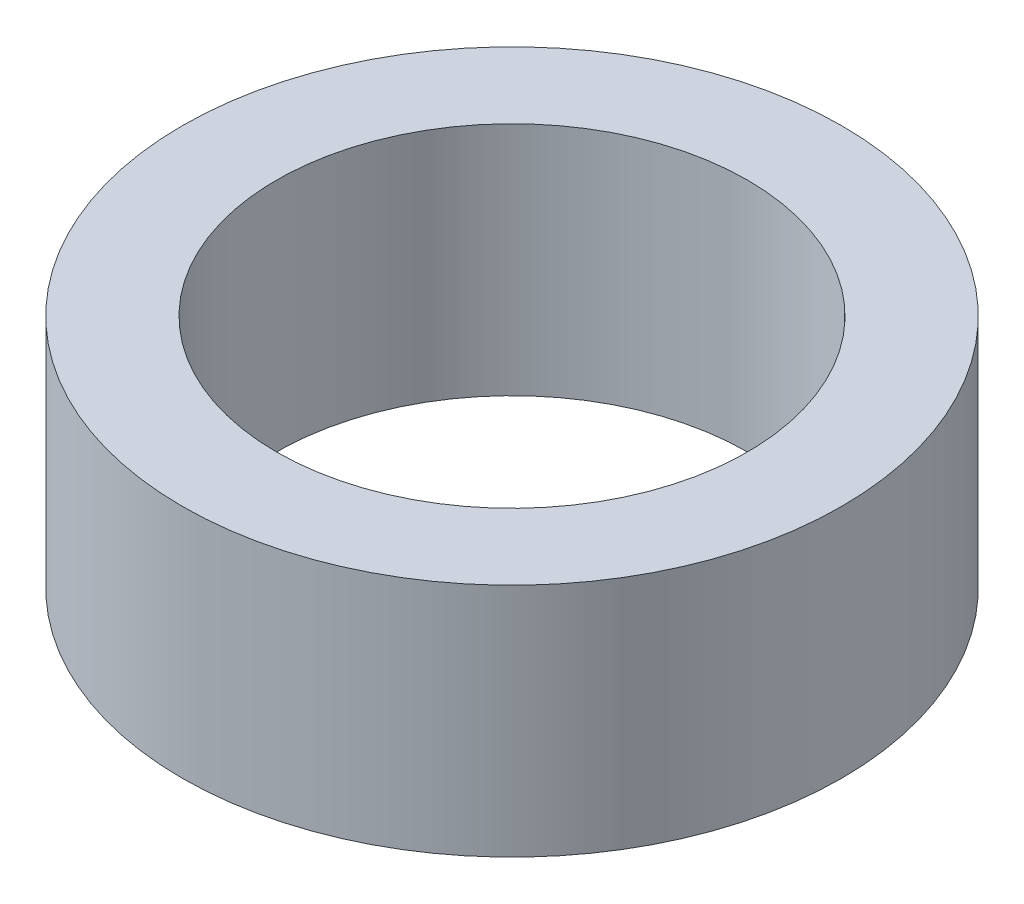
ISO-10303-21;
HEADER;
FILE_DESCRIPTION(('STEP AP214'),'2;1');
FILE_NAME('part.step','',(''),(''),'','','');
FILE_SCHEMA(('AUTOMOTIVE_DESIGN { 1 0 10303 214 1 1 1 1 }'));
ENDSEC;
DATA;
#1=APPLICATION_CONTEXT('core data for automotive mechanical design processes');
#2=APPLICATION_PROTOCOL_DEFINITION('international standard','automotive_design',2000,#1);
#3=PRODUCT_CONTEXT('',#1,'mechanical');
#4=PRODUCT('Part','Part','',(#3));
#5=PRODUCT_RELATED_PRODUCT_CATEGORY('part','',(#4));
#6=PRODUCT_DEFINITION_FORMATION('','',#4);
#7=PRODUCT_DEFINITION_CONTEXT('part definition',#1,'design');
#8=PRODUCT_DEFINITION('design','',#6,#7);
#9=PRODUCT_DEFINITION_SHAPE('','',#8);
#10=(LENGTH_UNIT() NAMED_UNIT(*) SI_UNIT(.MILLI.,.METRE.));
#11=(NAMED_UNIT(*) PLANE_ANGLE_UNIT() SI_UNIT($,.RADIAN.));
#12=(NAMED_UNIT(*) SI_UNIT($,.STERADIAN.) SOLID_ANGLE_UNIT());
#13=UNCERTAINTY_MEASURE_WITH_UNIT(LENGTH_MEASURE(1.E-05),#10,'distance_accuracy_value','');
#14=(GEOMETRIC_REPRESENTATION_CONTEXT(3) GLOBAL_UNCERTAINTY_ASSIGNED_CONTEXT((#13)) GLOBAL_UNIT_ASSIGNED_CONTEXT((#10,
#11,#12)) REPRESENTATION_CONTEXT('',''));
#15=CARTESIAN_POINT('',(0.,0.,0.));
#16=DIRECTION('',(0.,0.,1.));
#17=DIRECTION('',(1.,0.,0.));
#18=AXIS2_PLACEMENT_3D('',#15,#16,#17);
#19=CARTESIAN_POINT('',(0.,5.,0.));
#20=DIRECTION('',(0.,1.,0.));
#21=DIRECTION('',(0.,0.,1.));
#22=AXIS2_PLACEMENT_3D('',#19,#20,#21);
#23=PLANE('',#22);
#24=CARTESIAN_POINT('',(0.,5.,0.));
#25=DIRECTION('',(0.,1.,0.));
#26=DIRECTION('',(0.,0.,1.));
#27=AXIS2_PLACEMENT_3D('',#24,#25,#26);
#28=CIRCLE('',#27,7.);
#29=CARTESIAN_POINT('',(0.,5.,7.));
#30=VERTEX_POINT('',#29);
#31=EDGE_CURVE('E10',#30,#30,#28,.T.);
#32=ORIENTED_EDGE('',*,*,#31,.T.);
#33=EDGE_LOOP('',(#32));
#34=FACE_BOUND('',#33,.T.);
#35=CARTESIAN_POINT('',(0.,5.,0.));
#36=DIRECTION('',(0.,1.,0.));
#37=DIRECTION('',(0.,0.,1.));
#38=AXIS2_PLACEMENT_3D('',#35,#36,#37);
#39=CIRCLE('',#38,5.);
#40=CARTESIAN_POINT('',(0.,5.,5.));
#41=VERTEX_POINT('',#40);
#42=EDGE_CURVE('E41',#41,#41,#39,.T.);
#43=ORIENTED_EDGE('',*,*,#42,.F.);
#44=EDGE_LOOP('',(#43));
#45=FACE_BOUND('',#44,.T.);
#46=ADVANCED_FACE('F30',(#34,#45),#23,.T.);
#47=CARTESIAN_POINT('',(0.,0.,0.));
#48=DIRECTION('',(0.,1.,0.));
#49=DIRECTION('',(0.,0.,1.));
#50=AXIS2_PLACEMENT_3D('',#47,#48,#49);
#51=PLANE('',#50);
#52=CARTESIAN_POINT('',(0.,0.,0.));
#53=DIRECTION('',(0.,1.,0.));
#54=DIRECTION('',(0.,0.,1.));
#55=AXIS2_PLACEMENT_3D('',#52,#53,#54);
#56=CIRCLE('',#55,7.);
#57=CARTESIAN_POINT('',(0.,0.,7.));
#58=VERTEX_POINT('',#57);
#59=EDGE_CURVE('E34',#58,#58,#56,.T.);
#60=ORIENTED_EDGE('',*,*,#59,.F.);
#61=EDGE_LOOP('',(#60));
#62=FACE_BOUND('',#61,.T.);
#63=CARTESIAN_POINT('',(0.,0.,0.));
#64=DIRECTION('',(0.,1.,0.));
#65=DIRECTION('',(0.,0.,1.));
#66=AXIS2_PLACEMENT_3D('',#63,#64,#65);
#67=CIRCLE('',#66,5.);
#68=CARTESIAN_POINT('',(0.,0.,5.));
#69=VERTEX_POINT('',#68);
#70=EDGE_CURVE('E43',#69,#69,#67,.T.);
#71=ORIENTED_EDGE('',*,*,#70,.T.);
#72=EDGE_LOOP('',(#71));
#73=FACE_BOUND('',#72,.T.);
#74=ADVANCED_FACE('F53',(#62,#73),#51,.F.);
#75=CARTESIAN_POINT('',(0.,5.,0.));
#76=DIRECTION('',(0.,-1.,0.));
#77=DIRECTION('',(0.,0.,-1.));
#78=AXIS2_PLACEMENT_3D('',#75,#76,#77);
#79=CYLINDRICAL_SURFACE('',#78,7.);
#80=ORIENTED_EDGE('',*,*,#31,.F.);
#81=EDGE_LOOP('',(#80));
#82=FACE_BOUND('',#81,.T.);
#83=ORIENTED_EDGE('',*,*,#59,.T.);
#84=EDGE_LOOP('',(#83));
#85=FACE_BOUND('',#84,.T.);
#86=ADVANCED_FACE('F32',(#82,#85),#79,.T.);
#87=CARTESIAN_POINT('',(0.,5.,0.));
#88=DIRECTION('',(0.,-1.,0.));
#89=DIRECTION('',(0.,0.,-1.));
#90=AXIS2_PLACEMENT_3D('',#87,#88,#89);
#91=CYLINDRICAL_SURFACE('',#90,5.);
#92=ORIENTED_EDGE('',*,*,#42,.T.);
#93=EDGE_LOOP('',(#92));
#94=FACE_BOUND('',#93,.T.);
#95=ORIENTED_EDGE('',*,*,#70,.F.);
#96=EDGE_LOOP('',(#95));
#97=FACE_BOUND('',#96,.T.);
#98=ADVANCED_FACE('F49',(#94,#97),#91,.F.);
#99=CLOSED_SHELL('',(#46,#74,#86,#98));
#100=MANIFOLD_SOLID_BREP('B2',#99);
#101=ADVANCED_BREP_SHAPE_REPRESENTATION('',(#18,#100),#14);
#102=SHAPE_DEFINITION_REPRESENTATION(#9,#101);
ENDSEC;
END-ISO-10303-21;
